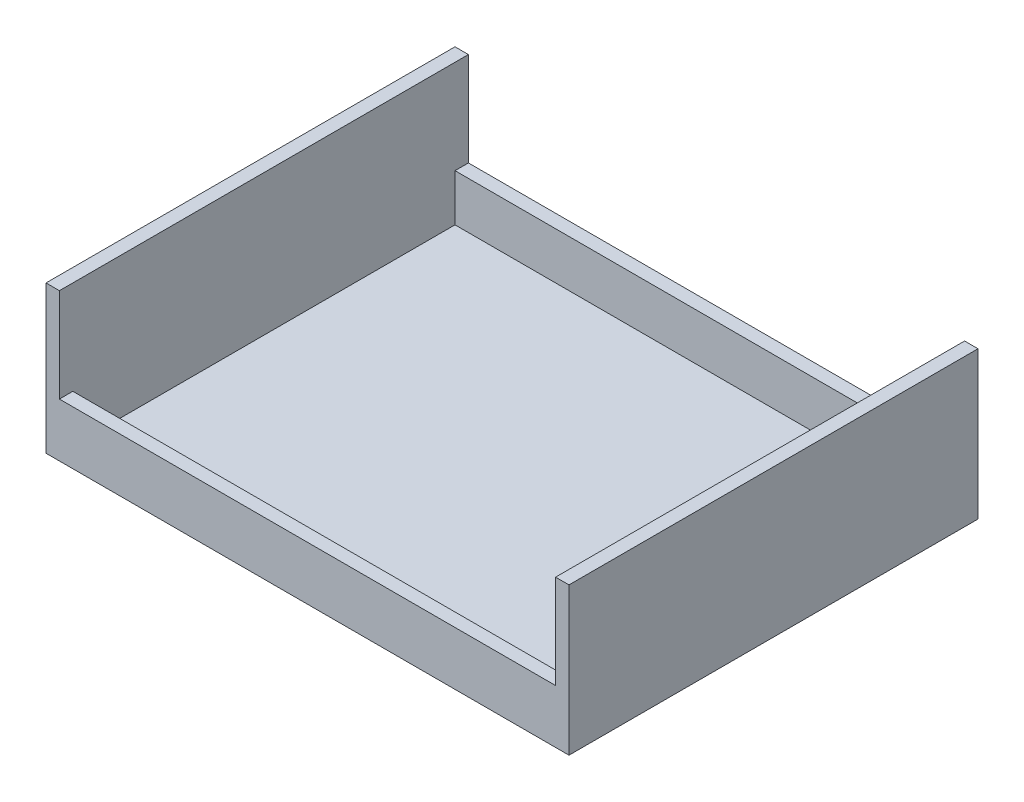
ISO-10303-21;
HEADER;
FILE_DESCRIPTION(('STEP AP214'),'2;1');
FILE_NAME('part.step','',(''),(''),'','','');
FILE_SCHEMA(('AUTOMOTIVE_DESIGN { 1 0 10303 214 1 1 1 1 }'));
ENDSEC;
DATA;
#1=APPLICATION_CONTEXT('core data for automotive mechanical design processes');
#2=APPLICATION_PROTOCOL_DEFINITION('international standard','automotive_design',2000,#1);
#3=PRODUCT_CONTEXT('',#1,'mechanical');
#4=PRODUCT('Part','Part','',(#3));
#5=PRODUCT_RELATED_PRODUCT_CATEGORY('part','',(#4));
#6=PRODUCT_DEFINITION_FORMATION('','',#4);
#7=PRODUCT_DEFINITION_CONTEXT('part definition',#1,'design');
#8=PRODUCT_DEFINITION('design','',#6,#7);
#9=PRODUCT_DEFINITION_SHAPE('','',#8);
#10=(LENGTH_UNIT() NAMED_UNIT(*) SI_UNIT(.MILLI.,.METRE.));
#11=(NAMED_UNIT(*) PLANE_ANGLE_UNIT() SI_UNIT($,.RADIAN.));
#12=(NAMED_UNIT(*) SI_UNIT($,.STERADIAN.) SOLID_ANGLE_UNIT());
#13=UNCERTAINTY_MEASURE_WITH_UNIT(LENGTH_MEASURE(1.E-05),#10,'distance_accuracy_value','');
#14=(GEOMETRIC_REPRESENTATION_CONTEXT(3) GLOBAL_UNCERTAINTY_ASSIGNED_CONTEXT((#13)) GLOBAL_UNIT_ASSIGNED_CONTEXT((#10,
#11,#12)) REPRESENTATION_CONTEXT('',''));
#15=CARTESIAN_POINT('',(0.,0.,0.));
#16=DIRECTION('',(0.,0.,1.));
#17=DIRECTION('',(1.,0.,0.));
#18=AXIS2_PLACEMENT_3D('',#15,#16,#17);
#19=CARTESIAN_POINT('',(0.,1.,0.));
#20=DIRECTION('',(0.,-1.,0.));
#21=DIRECTION('',(0.,0.,-1.));
#22=AXIS2_PLACEMENT_3D('',#19,#20,#21);
#23=PLANE('',#22);
#24=DIRECTION('',(1.,0.,0.));
#25=VECTOR('',#24,1.);
#26=CARTESIAN_POINT('',(76.,1.,-59.));
#27=LINE('',#26,#25);
#28=CARTESIAN_POINT('',(2.,1.,-59.));
#29=VERTEX_POINT('',#28);
#30=CARTESIAN_POINT('',(76.,1.,-59.));
#31=VERTEX_POINT('',#30);
#32=EDGE_CURVE('E61',#29,#31,#27,.T.);
#33=ORIENTED_EDGE('',*,*,#32,.F.);
#34=DIRECTION('',(0.,0.,-1.));
#35=VECTOR('',#34,1.);
#36=CARTESIAN_POINT('',(2.,1.,0.));
#37=LINE('',#36,#35);
#38=CARTESIAN_POINT('',(2.,1.,-2.));
#39=VERTEX_POINT('',#38);
#40=EDGE_CURVE('E39',#39,#29,#37,.T.);
#41=ORIENTED_EDGE('',*,*,#40,.F.);
#42=DIRECTION('',(-1.,0.,0.));
#43=VECTOR('',#42,1.);
#44=CARTESIAN_POINT('',(2.,1.,-2.));
#45=LINE('',#44,#43);
#46=CARTESIAN_POINT('',(76.,1.,-2.));
#47=VERTEX_POINT('',#46);
#48=EDGE_CURVE('E156',#47,#39,#45,.T.);
#49=ORIENTED_EDGE('',*,*,#48,.F.);
#50=DIRECTION('',(0.,0.,1.));
#51=VECTOR('',#50,1.);
#52=CARTESIAN_POINT('',(76.,1.,0.));
#53=LINE('',#52,#51);
#54=EDGE_CURVE('E134',#31,#47,#53,.T.);
#55=ORIENTED_EDGE('',*,*,#54,.F.);
#56=EDGE_LOOP('',(#33,#41,#49,#55));
#57=FACE_BOUND('',#56,.T.);
#58=ADVANCED_FACE('F35',(#57),#23,.F.);
#59=CARTESIAN_POINT('',(2.,22.,0.));
#60=DIRECTION('',(-1.,0.,0.));
#61=DIRECTION('',(0.,0.,1.));
#62=AXIS2_PLACEMENT_3D('',#59,#60,#61);
#63=PLANE('',#62);
#64=DIRECTION('',(0.,-1.,0.));
#65=VECTOR('',#64,1.);
#66=CARTESIAN_POINT('',(2.,8.,-59.));
#67=LINE('',#66,#65);
#68=CARTESIAN_POINT('',(2.,8.,-59.));
#69=VERTEX_POINT('',#68);
#70=EDGE_CURVE('E53',#69,#29,#67,.T.);
#71=ORIENTED_EDGE('',*,*,#70,.F.);
#72=DIRECTION('',(0.,0.,1.));
#73=VECTOR('',#72,1.);
#74=CARTESIAN_POINT('',(2.,8.,-61.));
#75=LINE('',#74,#73);
#76=CARTESIAN_POINT('',(2.,8.,-61.));
#77=VERTEX_POINT('',#76);
#78=EDGE_CURVE('E227',#77,#69,#75,.T.);
#79=ORIENTED_EDGE('',*,*,#78,.F.);
#80=DIRECTION('',(0.,-1.,0.));
#81=VECTOR('',#80,1.);
#82=CARTESIAN_POINT('',(2.,22.,-61.));
#83=LINE('',#82,#81);
#84=CARTESIAN_POINT('',(2.,22.,-61.));
#85=VERTEX_POINT('',#84);
#86=EDGE_CURVE('E183',#85,#77,#83,.T.);
#87=ORIENTED_EDGE('',*,*,#86,.F.);
#88=DIRECTION('',(0.,0.,-1.));
#89=VECTOR('',#88,1.);
#90=CARTESIAN_POINT('',(2.,22.,0.));
#91=LINE('',#90,#89);
#92=CARTESIAN_POINT('',(2.,22.,0.));
#93=VERTEX_POINT('',#92);
#94=EDGE_CURVE('E179',#93,#85,#91,.T.);
#95=ORIENTED_EDGE('',*,*,#94,.F.);
#96=DIRECTION('',(0.,-1.,0.));
#97=VECTOR('',#96,1.);
#98=CARTESIAN_POINT('',(2.,22.,0.));
#99=LINE('',#98,#97);
#100=CARTESIAN_POINT('',(2.,8.,0.));
#101=VERTEX_POINT('',#100);
#102=EDGE_CURVE('E190',#93,#101,#99,.T.);
#103=ORIENTED_EDGE('',*,*,#102,.T.);
#104=DIRECTION('',(0.,0.,1.));
#105=VECTOR('',#104,1.);
#106=CARTESIAN_POINT('',(2.,8.,0.));
#107=LINE('',#106,#105);
#108=CARTESIAN_POINT('',(2.,8.,-2.));
#109=VERTEX_POINT('',#108);
#110=EDGE_CURVE('E157',#109,#101,#107,.T.);
#111=ORIENTED_EDGE('',*,*,#110,.F.);
#112=DIRECTION('',(0.,-1.,0.));
#113=VECTOR('',#112,1.);
#114=CARTESIAN_POINT('',(2.,8.,-2.));
#115=LINE('',#114,#113);
#116=EDGE_CURVE('E139',#109,#39,#115,.T.);
#117=ORIENTED_EDGE('',*,*,#116,.T.);
#118=ORIENTED_EDGE('',*,*,#40,.T.);
#119=EDGE_LOOP('',(#71,#79,#87,#95,#103,#111,#117,#118));
#120=FACE_BOUND('',#119,.T.);
#121=ADVANCED_FACE('F211',(#120),#63,.F.);
#122=CARTESIAN_POINT('',(76.,22.,0.));
#123=DIRECTION('',(1.,0.,0.));
#124=DIRECTION('',(0.,0.,-1.));
#125=AXIS2_PLACEMENT_3D('',#122,#123,#124);
#126=PLANE('',#125);
#127=DIRECTION('',(0.,-1.,0.));
#128=VECTOR('',#127,1.);
#129=CARTESIAN_POINT('',(76.,8.,-59.));
#130=LINE('',#129,#128);
#131=CARTESIAN_POINT('',(76.,8.,-59.));
#132=VERTEX_POINT('',#131);
#133=EDGE_CURVE('E220',#132,#31,#130,.T.);
#134=ORIENTED_EDGE('',*,*,#133,.T.);
#135=ORIENTED_EDGE('',*,*,#54,.T.);
#136=DIRECTION('',(0.,-1.,0.));
#137=VECTOR('',#136,1.);
#138=CARTESIAN_POINT('',(76.,8.,-2.));
#139=LINE('',#138,#137);
#140=CARTESIAN_POINT('',(76.,8.,-2.));
#141=VERTEX_POINT('',#140);
#142=EDGE_CURVE('E128',#141,#47,#139,.T.);
#143=ORIENTED_EDGE('',*,*,#142,.F.);
#144=DIRECTION('',(0.,0.,-1.));
#145=VECTOR('',#144,1.);
#146=CARTESIAN_POINT('',(76.,8.,0.));
#147=LINE('',#146,#145);
#148=CARTESIAN_POINT('',(76.,8.,0.));
#149=VERTEX_POINT('',#148);
#150=EDGE_CURVE('E132',#149,#141,#147,.T.);
#151=ORIENTED_EDGE('',*,*,#150,.F.);
#152=DIRECTION('',(0.,-1.,0.));
#153=VECTOR('',#152,1.);
#154=CARTESIAN_POINT('',(76.,22.,0.));
#155=LINE('',#154,#153);
#156=CARTESIAN_POINT('',(76.,22.,0.));
#157=VERTEX_POINT('',#156);
#158=EDGE_CURVE('E169',#157,#149,#155,.T.);
#159=ORIENTED_EDGE('',*,*,#158,.F.);
#160=DIRECTION('',(0.,0.,1.));
#161=VECTOR('',#160,1.);
#162=CARTESIAN_POINT('',(76.,22.,0.));
#163=LINE('',#162,#161);
#164=CARTESIAN_POINT('',(76.,22.,-61.));
#165=VERTEX_POINT('',#164);
#166=EDGE_CURVE('E164',#165,#157,#163,.T.);
#167=ORIENTED_EDGE('',*,*,#166,.F.);
#168=DIRECTION('',(0.,-1.,0.));
#169=VECTOR('',#168,1.);
#170=CARTESIAN_POINT('',(76.,22.,-61.));
#171=LINE('',#170,#169);
#172=CARTESIAN_POINT('',(76.,8.,-61.));
#173=VERTEX_POINT('',#172);
#174=EDGE_CURVE('E172',#165,#173,#171,.T.);
#175=ORIENTED_EDGE('',*,*,#174,.T.);
#176=DIRECTION('',(0.,0.,-1.));
#177=VECTOR('',#176,1.);
#178=CARTESIAN_POINT('',(76.,8.,-61.));
#179=LINE('',#178,#177);
#180=EDGE_CURVE('E224',#132,#173,#179,.T.);
#181=ORIENTED_EDGE('',*,*,#180,.F.);
#182=EDGE_LOOP('',(#134,#135,#143,#151,#159,#167,#175,#181));
#183=FACE_BOUND('',#182,.T.);
#184=ADVANCED_FACE('F130',(#183),#126,.F.);
#185=CARTESIAN_POINT('',(0.,1.,0.));
#186=DIRECTION('',(1.,0.,0.));
#187=DIRECTION('',(0.,0.,-1.));
#188=AXIS2_PLACEMENT_3D('',#185,#186,#187);
#189=PLANE('',#188);
#190=DIRECTION('',(0.,0.,1.));
#191=VECTOR('',#190,1.);
#192=CARTESIAN_POINT('',(0.,0.,0.));
#193=LINE('',#192,#191);
#194=CARTESIAN_POINT('',(0.,0.,-61.));
#195=VERTEX_POINT('',#194);
#196=CARTESIAN_POINT('',(0.,0.,0.));
#197=VERTEX_POINT('',#196);
#198=EDGE_CURVE('E186',#195,#197,#193,.T.);
#199=ORIENTED_EDGE('',*,*,#198,.T.);
#200=DIRECTION('',(0.,-1.,0.));
#201=VECTOR('',#200,1.);
#202=CARTESIAN_POINT('',(0.,1.,0.));
#203=LINE('',#202,#201);
#204=CARTESIAN_POINT('',(0.,22.,0.));
#205=VERTEX_POINT('',#204);
#206=EDGE_CURVE('E11',#205,#197,#203,.T.);
#207=ORIENTED_EDGE('',*,*,#206,.F.);
#208=DIRECTION('',(0.,0.,1.));
#209=VECTOR('',#208,1.);
#210=CARTESIAN_POINT('',(0.,22.,0.));
#211=LINE('',#210,#209);
#212=CARTESIAN_POINT('',(0.,22.,-61.));
#213=VERTEX_POINT('',#212);
#214=EDGE_CURVE('E174',#213,#205,#211,.T.);
#215=ORIENTED_EDGE('',*,*,#214,.F.);
#216=DIRECTION('',(0.,-1.,0.));
#217=VECTOR('',#216,1.);
#218=CARTESIAN_POINT('',(0.,1.,-61.));
#219=LINE('',#218,#217);
#220=EDGE_CURVE('E196',#213,#195,#219,.T.);
#221=ORIENTED_EDGE('',*,*,#220,.T.);
#222=EDGE_LOOP('',(#199,#207,#215,#221));
#223=FACE_BOUND('',#222,.T.);
#224=ADVANCED_FACE('F37',(#223),#189,.F.);
#225=CARTESIAN_POINT('',(0.,1.,0.));
#226=DIRECTION('',(0.,0.,-1.));
#227=DIRECTION('',(-1.,0.,0.));
#228=AXIS2_PLACEMENT_3D('',#225,#226,#227);
#229=PLANE('',#228);
#230=DIRECTION('',(1.,0.,0.));
#231=VECTOR('',#230,1.);
#232=CARTESIAN_POINT('',(0.,0.,0.));
#233=LINE('',#232,#231);
#234=CARTESIAN_POINT('',(78.,0.,0.));
#235=VERTEX_POINT('',#234);
#236=EDGE_CURVE('E189',#197,#235,#233,.T.);
#237=ORIENTED_EDGE('',*,*,#236,.T.);
#238=DIRECTION('',(0.,-1.,0.));
#239=VECTOR('',#238,1.);
#240=CARTESIAN_POINT('',(78.,1.,0.));
#241=LINE('',#240,#239);
#242=CARTESIAN_POINT('',(78.,22.,0.));
#243=VERTEX_POINT('',#242);
#244=EDGE_CURVE('E45',#243,#235,#241,.T.);
#245=ORIENTED_EDGE('',*,*,#244,.F.);
#246=DIRECTION('',(1.,0.,0.));
#247=VECTOR('',#246,1.);
#248=CARTESIAN_POINT('',(78.,22.,0.));
#249=LINE('',#248,#247);
#250=EDGE_CURVE('E166',#157,#243,#249,.T.);
#251=ORIENTED_EDGE('',*,*,#250,.F.);
#252=ORIENTED_EDGE('',*,*,#158,.T.);
#253=DIRECTION('',(1.,0.,0.));
#254=VECTOR('',#253,1.);
#255=CARTESIAN_POINT('',(2.,8.,0.));
#256=LINE('',#255,#254);
#257=EDGE_CURVE('E149',#101,#149,#256,.T.);
#258=ORIENTED_EDGE('',*,*,#257,.F.);
#259=ORIENTED_EDGE('',*,*,#102,.F.);
#260=DIRECTION('',(1.,0.,0.));
#261=VECTOR('',#260,1.);
#262=CARTESIAN_POINT('',(0.,22.,0.));
#263=LINE('',#262,#261);
#264=EDGE_CURVE('E177',#205,#93,#263,.T.);
#265=ORIENTED_EDGE('',*,*,#264,.F.);
#266=ORIENTED_EDGE('',*,*,#206,.T.);
#267=EDGE_LOOP('',(#237,#245,#251,#252,#258,#259,#265,#266));
#268=FACE_BOUND('',#267,.T.);
#269=ADVANCED_FACE('F215',(#268),#229,.F.);
#270=CARTESIAN_POINT('',(78.,1.,0.));
#271=DIRECTION('',(-1.,0.,0.));
#272=DIRECTION('',(0.,0.,1.));
#273=AXIS2_PLACEMENT_3D('',#270,#271,#272);
#274=PLANE('',#273);
#275=DIRECTION('',(0.,0.,-1.));
#276=VECTOR('',#275,1.);
#277=CARTESIAN_POINT('',(78.,0.,0.));
#278=LINE('',#277,#276);
#279=CARTESIAN_POINT('',(78.,0.,-61.));
#280=VERTEX_POINT('',#279);
#281=EDGE_CURVE('E192',#235,#280,#278,.T.);
#282=ORIENTED_EDGE('',*,*,#281,.T.);
#283=DIRECTION('',(0.,-1.,0.));
#284=VECTOR('',#283,1.);
#285=CARTESIAN_POINT('',(78.,1.,-61.));
#286=LINE('',#285,#284);
#287=CARTESIAN_POINT('',(78.,22.,-61.));
#288=VERTEX_POINT('',#287);
#289=EDGE_CURVE('E199',#288,#280,#286,.T.);
#290=ORIENTED_EDGE('',*,*,#289,.F.);
#291=DIRECTION('',(0.,0.,-1.));
#292=VECTOR('',#291,1.);
#293=CARTESIAN_POINT('',(78.,22.,0.));
#294=LINE('',#293,#292);
#295=EDGE_CURVE('E159',#243,#288,#294,.T.);
#296=ORIENTED_EDGE('',*,*,#295,.F.);
#297=ORIENTED_EDGE('',*,*,#244,.T.);
#298=EDGE_LOOP('',(#282,#290,#296,#297));
#299=FACE_BOUND('',#298,.T.);
#300=ADVANCED_FACE('F269',(#299),#274,.F.);
#301=CARTESIAN_POINT('',(0.,1.,-61.));
#302=DIRECTION('',(0.,0.,1.));
#303=DIRECTION('',(1.,0.,0.));
#304=AXIS2_PLACEMENT_3D('',#301,#302,#303);
#305=PLANE('',#304);
#306=DIRECTION('',(-1.,0.,0.));
#307=VECTOR('',#306,1.);
#308=CARTESIAN_POINT('',(0.,0.,-61.));
#309=LINE('',#308,#307);
#310=EDGE_CURVE('E194',#280,#195,#309,.T.);
#311=ORIENTED_EDGE('',*,*,#310,.T.);
#312=ORIENTED_EDGE('',*,*,#220,.F.);
#313=DIRECTION('',(-1.,0.,0.));
#314=VECTOR('',#313,1.);
#315=CARTESIAN_POINT('',(0.,22.,-61.));
#316=LINE('',#315,#314);
#317=EDGE_CURVE('E181',#85,#213,#316,.T.);
#318=ORIENTED_EDGE('',*,*,#317,.F.);
#319=ORIENTED_EDGE('',*,*,#86,.T.);
#320=DIRECTION('',(-1.,0.,0.));
#321=VECTOR('',#320,1.);
#322=CARTESIAN_POINT('',(76.,8.,-61.));
#323=LINE('',#322,#321);
#324=EDGE_CURVE('E229',#173,#77,#323,.T.);
#325=ORIENTED_EDGE('',*,*,#324,.F.);
#326=ORIENTED_EDGE('',*,*,#174,.F.);
#327=DIRECTION('',(-1.,0.,0.));
#328=VECTOR('',#327,1.);
#329=CARTESIAN_POINT('',(78.,22.,-61.));
#330=LINE('',#329,#328);
#331=EDGE_CURVE('E162',#288,#165,#330,.T.);
#332=ORIENTED_EDGE('',*,*,#331,.F.);
#333=ORIENTED_EDGE('',*,*,#289,.T.);
#334=EDGE_LOOP('',(#311,#312,#318,#319,#325,#326,#332,#333));
#335=FACE_BOUND('',#334,.T.);
#336=ADVANCED_FACE('F242',(#335),#305,.F.);
#337=CARTESIAN_POINT('',(0.,0.,0.));
#338=DIRECTION('',(0.,-1.,0.));
#339=DIRECTION('',(0.,0.,-1.));
#340=AXIS2_PLACEMENT_3D('',#337,#338,#339);
#341=PLANE('',#340);
#342=ORIENTED_EDGE('',*,*,#198,.F.);
#343=ORIENTED_EDGE('',*,*,#310,.F.);
#344=ORIENTED_EDGE('',*,*,#281,.F.);
#345=ORIENTED_EDGE('',*,*,#236,.F.);
#346=EDGE_LOOP('',(#342,#343,#344,#345));
#347=FACE_BOUND('',#346,.T.);
#348=ADVANCED_FACE('F262',(#347),#341,.T.);
#349=CARTESIAN_POINT('',(0.,22.,0.));
#350=DIRECTION('',(0.,-1.,0.));
#351=DIRECTION('',(0.,0.,-1.));
#352=AXIS2_PLACEMENT_3D('',#349,#350,#351);
#353=PLANE('',#352);
#354=ORIENTED_EDGE('',*,*,#214,.T.);
#355=ORIENTED_EDGE('',*,*,#264,.T.);
#356=ORIENTED_EDGE('',*,*,#94,.T.);
#357=ORIENTED_EDGE('',*,*,#317,.T.);
#358=EDGE_LOOP('',(#354,#355,#356,#357));
#359=FACE_BOUND('',#358,.T.);
#360=ADVANCED_FACE('F265',(#359),#353,.F.);
#361=CARTESIAN_POINT('',(0.,22.,0.));
#362=DIRECTION('',(0.,1.,0.));
#363=DIRECTION('',(0.,0.,1.));
#364=AXIS2_PLACEMENT_3D('',#361,#362,#363);
#365=PLANE('',#364);
#366=ORIENTED_EDGE('',*,*,#295,.T.);
#367=ORIENTED_EDGE('',*,*,#331,.T.);
#368=ORIENTED_EDGE('',*,*,#166,.T.);
#369=ORIENTED_EDGE('',*,*,#250,.T.);
#370=EDGE_LOOP('',(#366,#367,#368,#369));
#371=FACE_BOUND('',#370,.T.);
#372=ADVANCED_FACE('F287',(#371),#365,.T.);
#373=CARTESIAN_POINT('',(2.,8.,-2.));
#374=DIRECTION('',(0.,0.,1.));
#375=DIRECTION('',(1.,0.,0.));
#376=AXIS2_PLACEMENT_3D('',#373,#374,#375);
#377=PLANE('',#376);
#378=ORIENTED_EDGE('',*,*,#48,.T.);
#379=ORIENTED_EDGE('',*,*,#116,.F.);
#380=DIRECTION('',(-1.,0.,0.));
#381=VECTOR('',#380,1.);
#382=CARTESIAN_POINT('',(2.,8.,-2.));
#383=LINE('',#382,#381);
#384=EDGE_CURVE('E146',#141,#109,#383,.T.);
#385=ORIENTED_EDGE('',*,*,#384,.F.);
#386=ORIENTED_EDGE('',*,*,#142,.T.);
#387=EDGE_LOOP('',(#378,#379,#385,#386));
#388=FACE_BOUND('',#387,.T.);
#389=ADVANCED_FACE('F151',(#388),#377,.F.);
#390=CARTESIAN_POINT('',(0.,8.,0.));
#391=DIRECTION('',(0.,-1.,0.));
#392=DIRECTION('',(0.,0.,-1.));
#393=AXIS2_PLACEMENT_3D('',#390,#391,#392);
#394=PLANE('',#393);
#395=ORIENTED_EDGE('',*,*,#110,.T.);
#396=ORIENTED_EDGE('',*,*,#257,.T.);
#397=ORIENTED_EDGE('',*,*,#150,.T.);
#398=ORIENTED_EDGE('',*,*,#384,.T.);
#399=EDGE_LOOP('',(#395,#396,#397,#398));
#400=FACE_BOUND('',#399,.T.);
#401=ADVANCED_FACE('F145',(#400),#394,.F.);
#402=CARTESIAN_POINT('',(76.,8.,-59.));
#403=DIRECTION('',(0.,0.,-1.));
#404=DIRECTION('',(-1.,0.,0.));
#405=AXIS2_PLACEMENT_3D('',#402,#403,#404);
#406=PLANE('',#405);
#407=ORIENTED_EDGE('',*,*,#32,.T.);
#408=ORIENTED_EDGE('',*,*,#133,.F.);
#409=DIRECTION('',(1.,0.,0.));
#410=VECTOR('',#409,1.);
#411=CARTESIAN_POINT('',(76.,8.,-59.));
#412=LINE('',#411,#410);
#413=EDGE_CURVE('E222',#69,#132,#412,.T.);
#414=ORIENTED_EDGE('',*,*,#413,.F.);
#415=ORIENTED_EDGE('',*,*,#70,.T.);
#416=EDGE_LOOP('',(#407,#408,#414,#415));
#417=FACE_BOUND('',#416,.T.);
#418=ADVANCED_FACE('F245',(#417),#406,.F.);
#419=CARTESIAN_POINT('',(0.,8.,0.));
#420=DIRECTION('',(0.,-1.,0.));
#421=DIRECTION('',(0.,0.,-1.));
#422=AXIS2_PLACEMENT_3D('',#419,#420,#421);
#423=PLANE('',#422);
#424=ORIENTED_EDGE('',*,*,#180,.T.);
#425=ORIENTED_EDGE('',*,*,#324,.T.);
#426=ORIENTED_EDGE('',*,*,#78,.T.);
#427=ORIENTED_EDGE('',*,*,#413,.T.);
#428=EDGE_LOOP('',(#424,#425,#426,#427));
#429=FACE_BOUND('',#428,.T.);
#430=ADVANCED_FACE('F234',(#429),#423,.F.);
#431=CLOSED_SHELL('',(#58,#121,#184,#224,#269,#300,#336,#348,#360,#372,#389,#401,#418,#430));
#432=MANIFOLD_SOLID_BREP('B2',#431);
#433=ADVANCED_BREP_SHAPE_REPRESENTATION('',(#18,#432),#14);
#434=SHAPE_DEFINITION_REPRESENTATION(#9,#433);
ENDSEC;
END-ISO-10303-21;
